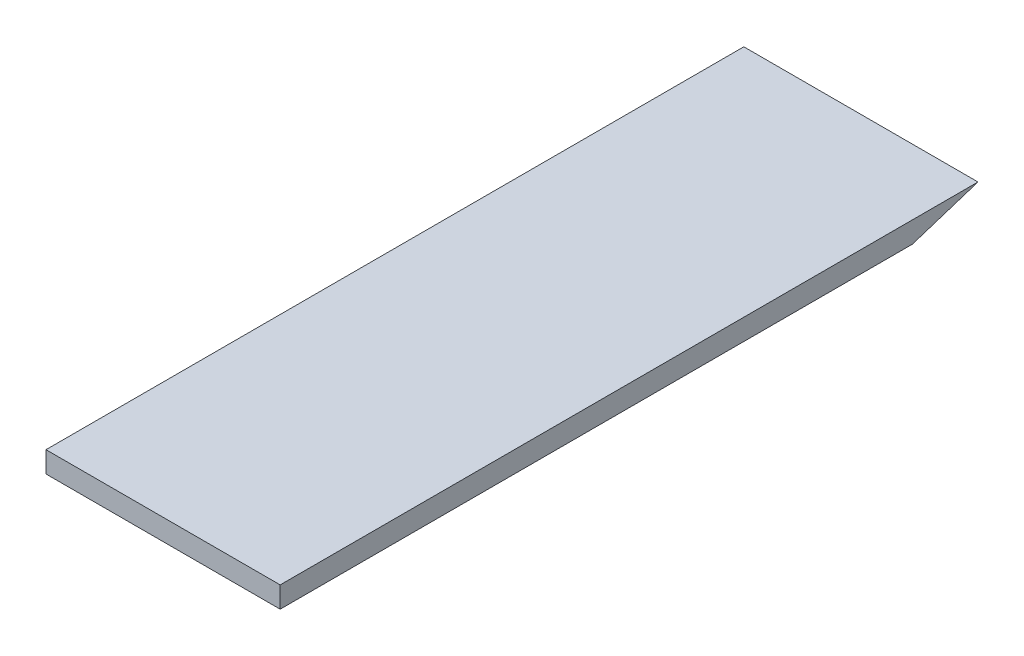
ISO-10303-21;
HEADER;
FILE_DESCRIPTION(('STEP AP214'),'2;1');
FILE_NAME('part.step','',(''),(''),'','','');
FILE_SCHEMA(('AUTOMOTIVE_DESIGN { 1 0 10303 214 1 1 1 1 }'));
ENDSEC;
DATA;
#1=APPLICATION_CONTEXT('core data for automotive mechanical design processes');
#2=APPLICATION_PROTOCOL_DEFINITION('international standard','automotive_design',2000,#1);
#3=PRODUCT_CONTEXT('',#1,'mechanical');
#4=PRODUCT('Part','Part','',(#3));
#5=PRODUCT_RELATED_PRODUCT_CATEGORY('part','',(#4));
#6=PRODUCT_DEFINITION_FORMATION('','',#4);
#7=PRODUCT_DEFINITION_CONTEXT('part definition',#1,'design');
#8=PRODUCT_DEFINITION('design','',#6,#7);
#9=PRODUCT_DEFINITION_SHAPE('','',#8);
#10=(LENGTH_UNIT() NAMED_UNIT(*) SI_UNIT(.MILLI.,.METRE.));
#11=(NAMED_UNIT(*) PLANE_ANGLE_UNIT() SI_UNIT($,.RADIAN.));
#12=(NAMED_UNIT(*) SI_UNIT($,.STERADIAN.) SOLID_ANGLE_UNIT());
#13=UNCERTAINTY_MEASURE_WITH_UNIT(LENGTH_MEASURE(1.E-05),#10,'distance_accuracy_value','');
#14=(GEOMETRIC_REPRESENTATION_CONTEXT(3) GLOBAL_UNCERTAINTY_ASSIGNED_CONTEXT((#13)) GLOBAL_UNIT_ASSIGNED_CONTEXT((#10,
#11,#12)) REPRESENTATION_CONTEXT('',''));
#15=CARTESIAN_POINT('',(0.,0.,0.));
#16=DIRECTION('',(0.,0.,1.));
#17=DIRECTION('',(1.,0.,0.));
#18=AXIS2_PLACEMENT_3D('',#15,#16,#17);
#19=CARTESIAN_POINT('',(100.,9.,0.));
#20=DIRECTION('',(0.,1.,0.));
#21=DIRECTION('',(0.,0.,1.));
#22=AXIS2_PLACEMENT_3D('',#19,#20,#21);
#23=PLANE('',#22);
#24=DIRECTION('',(0.,0.,-1.));
#25=VECTOR('',#24,1.);
#26=CARTESIAN_POINT('',(0.,9.,0.));
#27=LINE('',#26,#25);
#28=CARTESIAN_POINT('',(0.,9.,0.));
#29=VERTEX_POINT('',#28);
#30=CARTESIAN_POINT('',(0.,9.,-298.));
#31=VERTEX_POINT('',#30);
#32=EDGE_CURVE('E110',#29,#31,#27,.T.);
#33=ORIENTED_EDGE('',*,*,#32,.F.);
#34=DIRECTION('',(-1.,0.,0.));
#35=VECTOR('',#34,1.);
#36=CARTESIAN_POINT('',(100.,9.,0.));
#37=LINE('',#36,#35);
#38=CARTESIAN_POINT('',(100.,9.,0.));
#39=VERTEX_POINT('',#38);
#40=EDGE_CURVE('E11',#39,#29,#37,.T.);
#41=ORIENTED_EDGE('',*,*,#40,.F.);
#42=DIRECTION('',(0.,0.,-1.));
#43=VECTOR('',#42,1.);
#44=CARTESIAN_POINT('',(100.,9.,0.));
#45=LINE('',#44,#43);
#46=CARTESIAN_POINT('',(100.,9.,-298.));
#47=VERTEX_POINT('',#46);
#48=EDGE_CURVE('E103',#39,#47,#45,.T.);
#49=ORIENTED_EDGE('',*,*,#48,.T.);
#50=DIRECTION('',(-1.,0.,0.));
#51=VECTOR('',#50,1.);
#52=CARTESIAN_POINT('',(100.,9.,-298.));
#53=LINE('',#52,#51);
#54=EDGE_CURVE('E42',#47,#31,#53,.T.);
#55=ORIENTED_EDGE('',*,*,#54,.T.);
#56=EDGE_LOOP('',(#33,#41,#49,#55));
#57=FACE_BOUND('',#56,.T.);
#58=ADVANCED_FACE('F39',(#57),#23,.T.);
#59=CARTESIAN_POINT('',(100.,9.,0.));
#60=DIRECTION('',(0.,0.,-1.));
#61=DIRECTION('',(0.,1.,0.));
#62=AXIS2_PLACEMENT_3D('',#59,#60,#61);
#63=PLANE('',#62);
#64=DIRECTION('',(0.,-1.,0.));
#65=VECTOR('',#64,1.);
#66=CARTESIAN_POINT('',(0.,9.,0.));
#67=LINE('',#66,#65);
#68=CARTESIAN_POINT('',(0.,0.,0.));
#69=VERTEX_POINT('',#68);
#70=EDGE_CURVE('E73',#29,#69,#67,.T.);
#71=ORIENTED_EDGE('',*,*,#70,.T.);
#72=DIRECTION('',(-1.,0.,0.));
#73=VECTOR('',#72,1.);
#74=CARTESIAN_POINT('',(100.,0.,0.));
#75=LINE('',#74,#73);
#76=CARTESIAN_POINT('',(100.,0.,0.));
#77=VERTEX_POINT('',#76);
#78=EDGE_CURVE('E49',#77,#69,#75,.T.);
#79=ORIENTED_EDGE('',*,*,#78,.F.);
#80=DIRECTION('',(0.,-1.,0.));
#81=VECTOR('',#80,1.);
#82=CARTESIAN_POINT('',(100.,9.,0.));
#83=LINE('',#82,#81);
#84=EDGE_CURVE('E88',#39,#77,#83,.T.);
#85=ORIENTED_EDGE('',*,*,#84,.F.);
#86=ORIENTED_EDGE('',*,*,#40,.T.);
#87=EDGE_LOOP('',(#71,#79,#85,#86));
#88=FACE_BOUND('',#87,.T.);
#89=ADVANCED_FACE('F126',(#88),#63,.F.);
#90=CARTESIAN_POINT('',(100.,0.,0.));
#91=DIRECTION('',(0.,1.,0.));
#92=DIRECTION('',(0.,0.,1.));
#93=AXIS2_PLACEMENT_3D('',#90,#91,#92);
#94=PLANE('',#93);
#95=DIRECTION('',(0.,0.,-1.));
#96=VECTOR('',#95,1.);
#97=CARTESIAN_POINT('',(0.,0.,0.));
#98=LINE('',#97,#96);
#99=CARTESIAN_POINT('',(0.,0.,-270.));
#100=VERTEX_POINT('',#99);
#101=EDGE_CURVE('E96',#69,#100,#98,.T.);
#102=ORIENTED_EDGE('',*,*,#101,.T.);
#103=DIRECTION('',(-1.,0.,0.));
#104=VECTOR('',#103,1.);
#105=CARTESIAN_POINT('',(100.,0.,-270.));
#106=LINE('',#105,#104);
#107=CARTESIAN_POINT('',(100.,0.,-270.));
#108=VERTEX_POINT('',#107);
#109=EDGE_CURVE('E93',#108,#100,#106,.T.);
#110=ORIENTED_EDGE('',*,*,#109,.F.);
#111=DIRECTION('',(0.,0.,-1.));
#112=VECTOR('',#111,1.);
#113=CARTESIAN_POINT('',(100.,0.,0.));
#114=LINE('',#113,#112);
#115=EDGE_CURVE('E85',#77,#108,#114,.T.);
#116=ORIENTED_EDGE('',*,*,#115,.F.);
#117=ORIENTED_EDGE('',*,*,#78,.T.);
#118=EDGE_LOOP('',(#102,#110,#116,#117));
#119=FACE_BOUND('',#118,.T.);
#120=ADVANCED_FACE('F94',(#119),#94,.F.);
#121=CARTESIAN_POINT('',(100.,0.,-270.));
#122=DIRECTION('',(0.,0.952028561285264,0.30600918041312));
#123=DIRECTION('',(0.,-0.30600918041312,0.952028561285264));
#124=AXIS2_PLACEMENT_3D('',#121,#122,#123);
#125=PLANE('',#124);
#126=DIRECTION('',(0.,0.30600918041312,-0.952028561285264));
#127=VECTOR('',#126,1.);
#128=CARTESIAN_POINT('',(0.,0.,-270.));
#129=LINE('',#128,#127);
#130=EDGE_CURVE('E114',#100,#31,#129,.T.);
#131=ORIENTED_EDGE('',*,*,#130,.T.);
#132=ORIENTED_EDGE('',*,*,#54,.F.);
#133=DIRECTION('',(0.,0.30600918041312,-0.952028561285264));
#134=VECTOR('',#133,1.);
#135=CARTESIAN_POINT('',(100.,0.,-270.));
#136=LINE('',#135,#134);
#137=EDGE_CURVE('E82',#108,#47,#136,.T.);
#138=ORIENTED_EDGE('',*,*,#137,.F.);
#139=ORIENTED_EDGE('',*,*,#109,.T.);
#140=EDGE_LOOP('',(#131,#132,#138,#139));
#141=FACE_BOUND('',#140,.T.);
#142=ADVANCED_FACE('F101',(#141),#125,.F.);
#143=CARTESIAN_POINT('',(100.,0.,0.));
#144=DIRECTION('',(-1.,0.,0.));
#145=DIRECTION('',(0.,0.,1.));
#146=AXIS2_PLACEMENT_3D('',#143,#144,#145);
#147=PLANE('',#146);
#148=ORIENTED_EDGE('',*,*,#48,.F.);
#149=ORIENTED_EDGE('',*,*,#84,.T.);
#150=ORIENTED_EDGE('',*,*,#115,.T.);
#151=ORIENTED_EDGE('',*,*,#137,.T.);
#152=EDGE_LOOP('',(#148,#149,#150,#151));
#153=FACE_BOUND('',#152,.T.);
#154=ADVANCED_FACE('F87',(#153),#147,.F.);
#155=CARTESIAN_POINT('',(0.,0.,0.));
#156=DIRECTION('',(-1.,0.,0.));
#157=DIRECTION('',(0.,0.,1.));
#158=AXIS2_PLACEMENT_3D('',#155,#156,#157);
#159=PLANE('',#158);
#160=ORIENTED_EDGE('',*,*,#32,.T.);
#161=ORIENTED_EDGE('',*,*,#130,.F.);
#162=ORIENTED_EDGE('',*,*,#101,.F.);
#163=ORIENTED_EDGE('',*,*,#70,.F.);
#164=EDGE_LOOP('',(#160,#161,#162,#163));
#165=FACE_BOUND('',#164,.T.);
#166=ADVANCED_FACE('F123',(#165),#159,.T.);
#167=CLOSED_SHELL('',(#58,#89,#120,#142,#154,#166));
#168=MANIFOLD_SOLID_BREP('B2',#167);
#169=ADVANCED_BREP_SHAPE_REPRESENTATION('',(#18,#168),#14);
#170=SHAPE_DEFINITION_REPRESENTATION(#9,#169);
ENDSEC;
END-ISO-10303-21;
